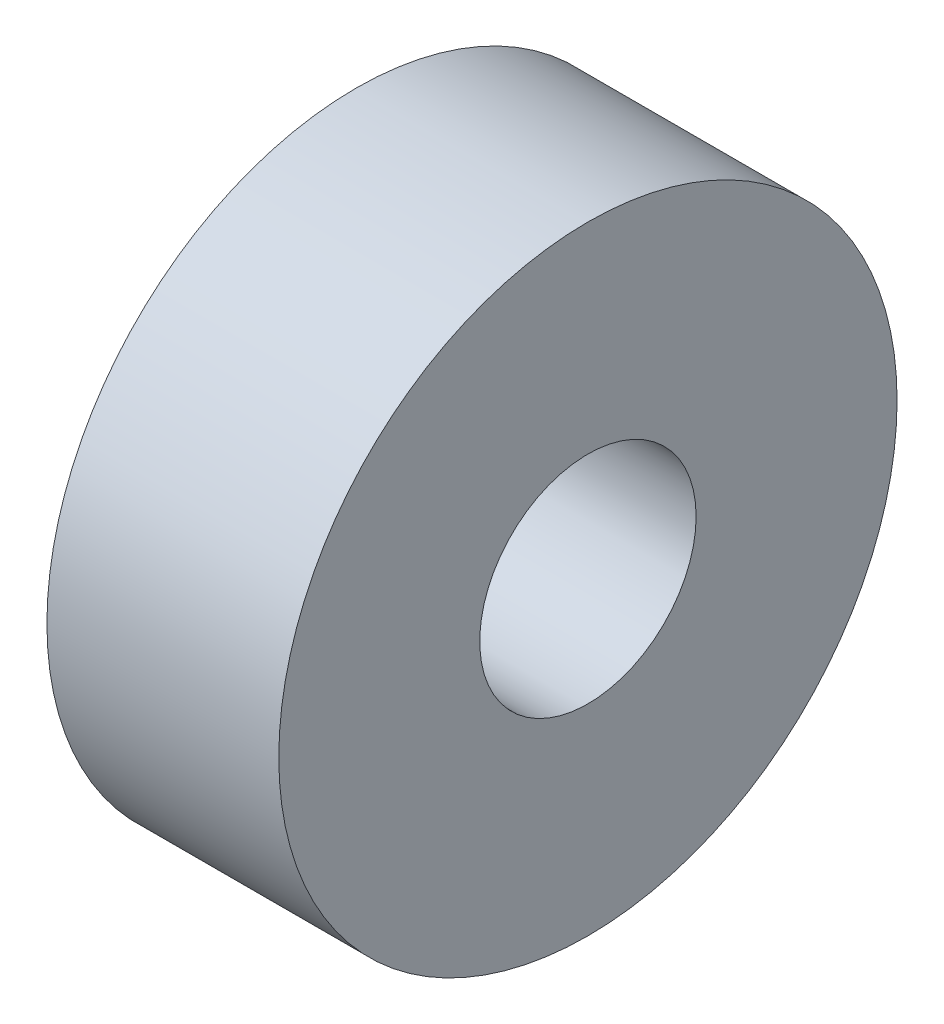
ISO-10303-21;
HEADER;
FILE_DESCRIPTION(('STEP AP214'),'2;1');
FILE_NAME('part.step','',(''),(''),'','','');
FILE_SCHEMA(('AUTOMOTIVE_DESIGN { 1 0 10303 214 1 1 1 1 }'));
ENDSEC;
DATA;
#1=APPLICATION_CONTEXT('core data for automotive mechanical design processes');
#2=APPLICATION_PROTOCOL_DEFINITION('international standard','automotive_design',2000,#1);
#3=PRODUCT_CONTEXT('',#1,'mechanical');
#4=PRODUCT('Part','Part','',(#3));
#5=PRODUCT_RELATED_PRODUCT_CATEGORY('part','',(#4));
#6=PRODUCT_DEFINITION_FORMATION('','',#4);
#7=PRODUCT_DEFINITION_CONTEXT('part definition',#1,'design');
#8=PRODUCT_DEFINITION('design','',#6,#7);
#9=PRODUCT_DEFINITION_SHAPE('','',#8);
#10=(LENGTH_UNIT() NAMED_UNIT(*) SI_UNIT(.MILLI.,.METRE.));
#11=(NAMED_UNIT(*) PLANE_ANGLE_UNIT() SI_UNIT($,.RADIAN.));
#12=(NAMED_UNIT(*) SI_UNIT($,.STERADIAN.) SOLID_ANGLE_UNIT());
#13=UNCERTAINTY_MEASURE_WITH_UNIT(LENGTH_MEASURE(1.E-05),#10,'distance_accuracy_value','');
#14=(GEOMETRIC_REPRESENTATION_CONTEXT(3) GLOBAL_UNCERTAINTY_ASSIGNED_CONTEXT((#13)) GLOBAL_UNIT_ASSIGNED_CONTEXT((#10,
#11,#12)) REPRESENTATION_CONTEXT('',''));
#15=CARTESIAN_POINT('',(0.,0.,0.));
#16=DIRECTION('',(0.,0.,1.));
#17=DIRECTION('',(1.,0.,0.));
#18=AXIS2_PLACEMENT_3D('',#15,#16,#17);
#19=CARTESIAN_POINT('',(3.,0.,0.));
#20=DIRECTION('',(1.,0.,0.));
#21=DIRECTION('',(0.,0.,-1.));
#22=AXIS2_PLACEMENT_3D('',#19,#20,#21);
#23=PLANE('',#22);
#24=CARTESIAN_POINT('',(3.,0.,0.));
#25=DIRECTION('',(1.,0.,0.));
#26=DIRECTION('',(0.,0.,-1.));
#27=AXIS2_PLACEMENT_3D('',#24,#25,#26);
#28=CIRCLE('',#27,4.);
#29=CARTESIAN_POINT('',(3.,0.,-4.));
#30=VERTEX_POINT('',#29);
#31=EDGE_CURVE('E10',#30,#30,#28,.T.);
#32=ORIENTED_EDGE('',*,*,#31,.T.);
#33=EDGE_LOOP('',(#32));
#34=FACE_BOUND('',#33,.T.);
#35=CARTESIAN_POINT('',(3.,0.,0.));
#36=DIRECTION('',(1.,0.,0.));
#37=DIRECTION('',(0.,0.,-1.));
#38=AXIS2_PLACEMENT_3D('',#35,#36,#37);
#39=CIRCLE('',#38,1.4);
#40=CARTESIAN_POINT('',(3.,0.,-1.4));
#41=VERTEX_POINT('',#40);
#42=EDGE_CURVE('E54',#41,#41,#39,.T.);
#43=ORIENTED_EDGE('',*,*,#42,.F.);
#44=EDGE_LOOP('',(#43));
#45=FACE_BOUND('',#44,.T.);
#46=ADVANCED_FACE('F41',(#34,#45),#23,.T.);
#47=CARTESIAN_POINT('',(0.,0.,0.));
#48=DIRECTION('',(1.,0.,0.));
#49=DIRECTION('',(0.,0.,-1.));
#50=AXIS2_PLACEMENT_3D('',#47,#48,#49);
#51=PLANE('',#50);
#52=CARTESIAN_POINT('',(0.,0.,0.));
#53=DIRECTION('',(1.,0.,0.));
#54=DIRECTION('',(0.,0.,-1.));
#55=AXIS2_PLACEMENT_3D('',#52,#53,#54);
#56=CIRCLE('',#55,4.);
#57=CARTESIAN_POINT('',(0.,0.,-4.));
#58=VERTEX_POINT('',#57);
#59=EDGE_CURVE('E45',#58,#58,#56,.T.);
#60=ORIENTED_EDGE('',*,*,#59,.F.);
#61=EDGE_LOOP('',(#60));
#62=FACE_BOUND('',#61,.T.);
#63=CARTESIAN_POINT('',(0.,0.,0.));
#64=DIRECTION('',(1.,0.,0.));
#65=DIRECTION('',(0.,0.,-1.));
#66=AXIS2_PLACEMENT_3D('',#63,#64,#65);
#67=CIRCLE('',#66,1.4);
#68=CARTESIAN_POINT('',(0.,0.,-1.4));
#69=VERTEX_POINT('',#68);
#70=EDGE_CURVE('E56',#69,#69,#67,.T.);
#71=ORIENTED_EDGE('',*,*,#70,.T.);
#72=EDGE_LOOP('',(#71));
#73=FACE_BOUND('',#72,.T.);
#74=ADVANCED_FACE('F68',(#62,#73),#51,.F.);
#75=CARTESIAN_POINT('',(3.,0.,0.));
#76=DIRECTION('',(-1.,0.,0.));
#77=DIRECTION('',(0.,0.,1.));
#78=AXIS2_PLACEMENT_3D('',#75,#76,#77);
#79=CYLINDRICAL_SURFACE('',#78,4.);
#80=ORIENTED_EDGE('',*,*,#31,.F.);
#81=EDGE_LOOP('',(#80));
#82=FACE_BOUND('',#81,.T.);
#83=ORIENTED_EDGE('',*,*,#59,.T.);
#84=EDGE_LOOP('',(#83));
#85=FACE_BOUND('',#84,.T.);
#86=ADVANCED_FACE('F43',(#82,#85),#79,.T.);
#87=CARTESIAN_POINT('',(3.,0.,0.));
#88=DIRECTION('',(-1.,0.,0.));
#89=DIRECTION('',(0.,0.,1.));
#90=AXIS2_PLACEMENT_3D('',#87,#88,#89);
#91=CYLINDRICAL_SURFACE('',#90,1.4);
#92=ORIENTED_EDGE('',*,*,#42,.T.);
#93=EDGE_LOOP('',(#92));
#94=FACE_BOUND('',#93,.T.);
#95=ORIENTED_EDGE('',*,*,#70,.F.);
#96=EDGE_LOOP('',(#95));
#97=FACE_BOUND('',#96,.T.);
#98=ADVANCED_FACE('F64',(#94,#97),#91,.F.);
#99=CLOSED_SHELL('',(#46,#74,#86,#98));
#100=MANIFOLD_SOLID_BREP('B2',#99);
#101=ADVANCED_BREP_SHAPE_REPRESENTATION('',(#18,#100),#14);
#102=SHAPE_DEFINITION_REPRESENTATION(#9,#101);
ENDSEC;
END-ISO-10303-21;
